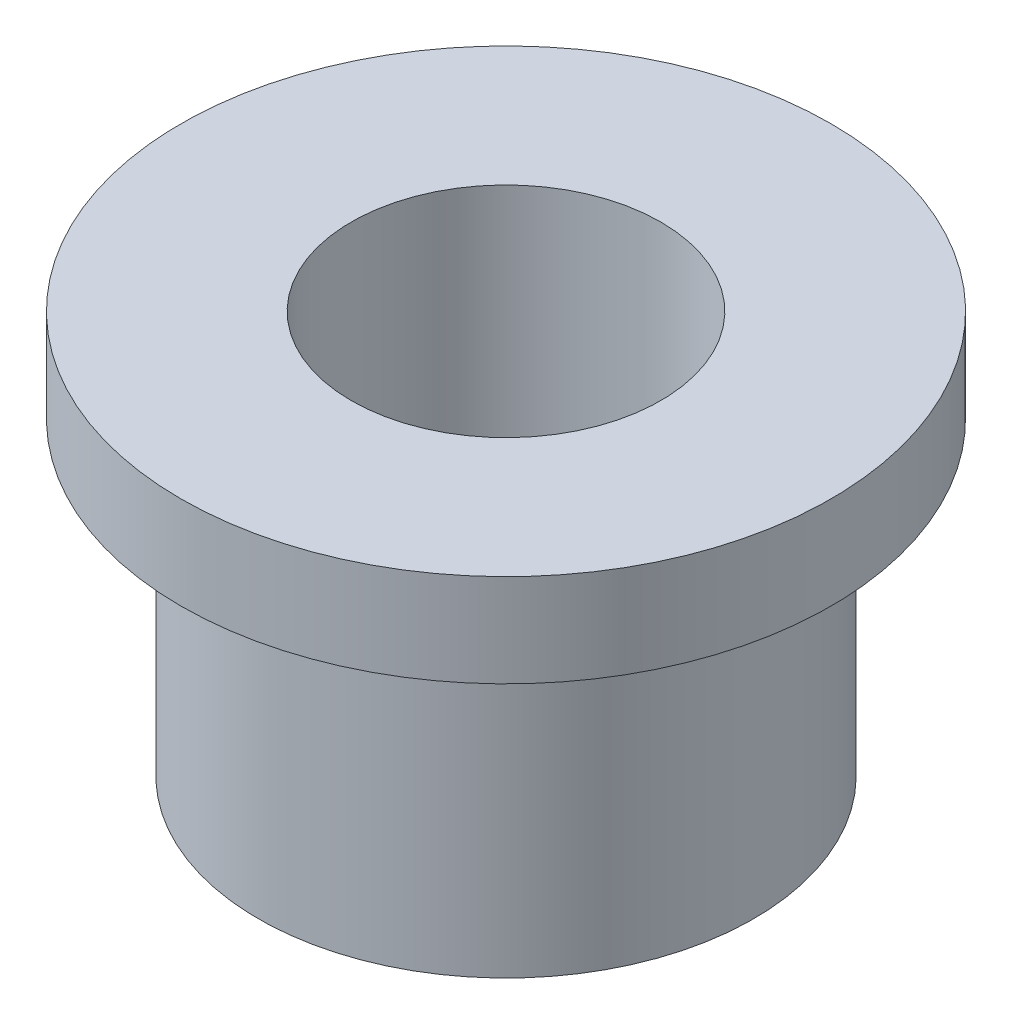
ISO-10303-21;
HEADER;
FILE_DESCRIPTION(('STEP AP214'),'2;1');
FILE_NAME('part.step','',(''),(''),'','','');
FILE_SCHEMA(('AUTOMOTIVE_DESIGN { 1 0 10303 214 1 1 1 1 }'));
ENDSEC;
DATA;
#1=APPLICATION_CONTEXT('core data for automotive mechanical design processes');
#2=APPLICATION_PROTOCOL_DEFINITION('international standard','automotive_design',2000,#1);
#3=PRODUCT_CONTEXT('',#1,'mechanical');
#4=PRODUCT('Part','Part','',(#3));
#5=PRODUCT_RELATED_PRODUCT_CATEGORY('part','',(#4));
#6=PRODUCT_DEFINITION_FORMATION('','',#4);
#7=PRODUCT_DEFINITION_CONTEXT('part definition',#1,'design');
#8=PRODUCT_DEFINITION('design','',#6,#7);
#9=PRODUCT_DEFINITION_SHAPE('','',#8);
#10=(LENGTH_UNIT() NAMED_UNIT(*) SI_UNIT(.MILLI.,.METRE.));
#11=(NAMED_UNIT(*) PLANE_ANGLE_UNIT() SI_UNIT($,.RADIAN.));
#12=(NAMED_UNIT(*) SI_UNIT($,.STERADIAN.) SOLID_ANGLE_UNIT());
#13=UNCERTAINTY_MEASURE_WITH_UNIT(LENGTH_MEASURE(1.E-05),#10,'distance_accuracy_value','');
#14=(GEOMETRIC_REPRESENTATION_CONTEXT(3) GLOBAL_UNCERTAINTY_ASSIGNED_CONTEXT((#13)) GLOBAL_UNIT_ASSIGNED_CONTEXT((#10,
#11,#12)) REPRESENTATION_CONTEXT('',''));
#15=CARTESIAN_POINT('',(0.,0.,0.));
#16=DIRECTION('',(0.,0.,1.));
#17=DIRECTION('',(1.,0.,0.));
#18=AXIS2_PLACEMENT_3D('',#15,#16,#17);
#19=CARTESIAN_POINT('',(4.,0.,0.));
#20=DIRECTION('',(0.,-1.,0.));
#21=DIRECTION('',(0.,0.,-1.));
#22=AXIS2_PLACEMENT_3D('',#19,#20,#21);
#23=PLANE('',#22);
#24=CARTESIAN_POINT('',(0.,0.,0.));
#25=DIRECTION('',(0.,-1.,0.));
#26=DIRECTION('',(0.,0.,-1.));
#27=AXIS2_PLACEMENT_3D('',#24,#25,#26);
#28=CIRCLE('',#27,4.);
#29=CARTESIAN_POINT('',(0.,0.,-4.));
#30=VERTEX_POINT('',#29);
#31=EDGE_CURVE('E52',#30,#30,#28,.T.);
#32=ORIENTED_EDGE('',*,*,#31,.T.);
#33=EDGE_LOOP('',(#32));
#34=FACE_BOUND('',#33,.T.);
#35=CARTESIAN_POINT('',(0.,0.,0.));
#36=DIRECTION('',(0.,-1.,0.));
#37=DIRECTION('',(0.,0.,-1.));
#38=AXIS2_PLACEMENT_3D('',#35,#36,#37);
#39=CIRCLE('',#38,2.5);
#40=CARTESIAN_POINT('',(0.,0.,-2.5));
#41=VERTEX_POINT('',#40);
#42=EDGE_CURVE('E10',#41,#41,#39,.T.);
#43=ORIENTED_EDGE('',*,*,#42,.F.);
#44=EDGE_LOOP('',(#43));
#45=FACE_BOUND('',#44,.T.);
#46=ADVANCED_FACE('F30',(#34,#45),#23,.T.);
#47=CARTESIAN_POINT('',(0.,0.,0.));
#48=DIRECTION('',(0.,-1.,0.));
#49=DIRECTION('',(0.,0.,-1.));
#50=AXIS2_PLACEMENT_3D('',#47,#48,#49);
#51=CYLINDRICAL_SURFACE('',#50,2.5);
#52=ORIENTED_EDGE('',*,*,#42,.T.);
#53=EDGE_LOOP('',(#52));
#54=FACE_BOUND('',#53,.T.);
#55=CARTESIAN_POINT('',(0.,6.5,0.));
#56=DIRECTION('',(0.,-1.,0.));
#57=DIRECTION('',(0.,0.,-1.));
#58=AXIS2_PLACEMENT_3D('',#55,#56,#57);
#59=CIRCLE('',#58,2.5);
#60=CARTESIAN_POINT('',(0.,6.5,-2.5));
#61=VERTEX_POINT('',#60);
#62=EDGE_CURVE('E36',#61,#61,#59,.T.);
#63=ORIENTED_EDGE('',*,*,#62,.F.);
#64=EDGE_LOOP('',(#63));
#65=FACE_BOUND('',#64,.T.);
#66=ADVANCED_FACE('F70',(#54,#65),#51,.F.);
#67=CARTESIAN_POINT('',(2.5,6.5,0.));
#68=DIRECTION('',(0.,1.,0.));
#69=DIRECTION('',(0.,0.,1.));
#70=AXIS2_PLACEMENT_3D('',#67,#68,#69);
#71=PLANE('',#70);
#72=ORIENTED_EDGE('',*,*,#62,.T.);
#73=EDGE_LOOP('',(#72));
#74=FACE_BOUND('',#73,.T.);
#75=CARTESIAN_POINT('',(0.,6.5,0.));
#76=DIRECTION('',(0.,-1.,0.));
#77=DIRECTION('',(0.,0.,-1.));
#78=AXIS2_PLACEMENT_3D('',#75,#76,#77);
#79=CIRCLE('',#78,5.25);
#80=CARTESIAN_POINT('',(0.,6.5,-5.25));
#81=VERTEX_POINT('',#80);
#82=EDGE_CURVE('E40',#81,#81,#79,.T.);
#83=ORIENTED_EDGE('',*,*,#82,.F.);
#84=EDGE_LOOP('',(#83));
#85=FACE_BOUND('',#84,.T.);
#86=ADVANCED_FACE('F74',(#74,#85),#71,.T.);
#87=CARTESIAN_POINT('',(0.,0.,0.));
#88=DIRECTION('',(0.,-1.,0.));
#89=DIRECTION('',(0.,0.,-1.));
#90=AXIS2_PLACEMENT_3D('',#87,#88,#89);
#91=CYLINDRICAL_SURFACE('',#90,5.25);
#92=ORIENTED_EDGE('',*,*,#82,.T.);
#93=EDGE_LOOP('',(#92));
#94=FACE_BOUND('',#93,.T.);
#95=CARTESIAN_POINT('',(0.,5.,0.));
#96=DIRECTION('',(0.,-1.,0.));
#97=DIRECTION('',(0.,0.,-1.));
#98=AXIS2_PLACEMENT_3D('',#95,#96,#97);
#99=CIRCLE('',#98,5.25);
#100=CARTESIAN_POINT('',(0.,5.,-5.25));
#101=VERTEX_POINT('',#100);
#102=EDGE_CURVE('E44',#101,#101,#99,.T.);
#103=ORIENTED_EDGE('',*,*,#102,.F.);
#104=EDGE_LOOP('',(#103));
#105=FACE_BOUND('',#104,.T.);
#106=ADVANCED_FACE('F66',(#94,#105),#91,.T.);
#107=CARTESIAN_POINT('',(5.25,5.,0.));
#108=DIRECTION('',(0.,-1.,0.));
#109=DIRECTION('',(0.,0.,-1.));
#110=AXIS2_PLACEMENT_3D('',#107,#108,#109);
#111=PLANE('',#110);
#112=ORIENTED_EDGE('',*,*,#102,.T.);
#113=EDGE_LOOP('',(#112));
#114=FACE_BOUND('',#113,.T.);
#115=CARTESIAN_POINT('',(0.,5.,0.));
#116=DIRECTION('',(0.,-1.,0.));
#117=DIRECTION('',(0.,0.,-1.));
#118=AXIS2_PLACEMENT_3D('',#115,#116,#117);
#119=CIRCLE('',#118,4.);
#120=CARTESIAN_POINT('',(0.,5.,-4.));
#121=VERTEX_POINT('',#120);
#122=EDGE_CURVE('E49',#121,#121,#119,.T.);
#123=ORIENTED_EDGE('',*,*,#122,.F.);
#124=EDGE_LOOP('',(#123));
#125=FACE_BOUND('',#124,.T.);
#126=ADVANCED_FACE('F60',(#114,#125),#111,.T.);
#127=CARTESIAN_POINT('',(0.,0.,0.));
#128=DIRECTION('',(0.,-1.,0.));
#129=DIRECTION('',(0.,0.,-1.));
#130=AXIS2_PLACEMENT_3D('',#127,#128,#129);
#131=CYLINDRICAL_SURFACE('',#130,4.);
#132=ORIENTED_EDGE('',*,*,#122,.T.);
#133=EDGE_LOOP('',(#132));
#134=FACE_BOUND('',#133,.T.);
#135=ORIENTED_EDGE('',*,*,#31,.F.);
#136=EDGE_LOOP('',(#135));
#137=FACE_BOUND('',#136,.T.);
#138=ADVANCED_FACE('F58',(#134,#137),#131,.T.);
#139=CLOSED_SHELL('',(#46,#66,#86,#106,#126,#138));
#140=MANIFOLD_SOLID_BREP('B2',#139);
#141=ADVANCED_BREP_SHAPE_REPRESENTATION('',(#18,#140),#14);
#142=SHAPE_DEFINITION_REPRESENTATION(#9,#141);
ENDSEC;
END-ISO-10303-21;
